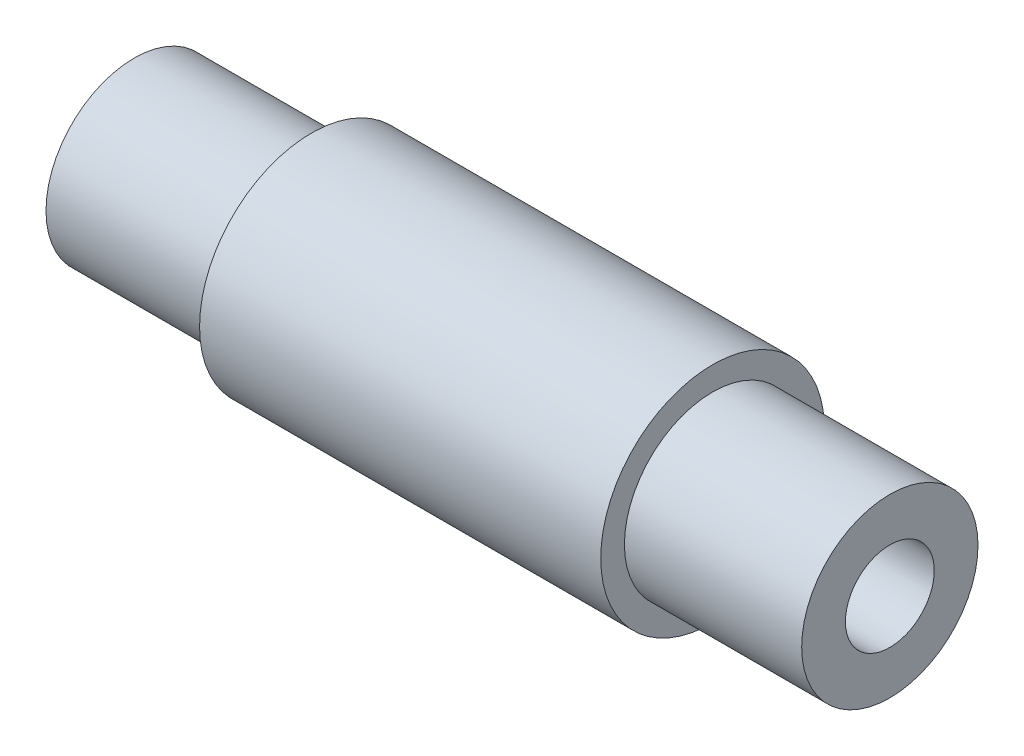
ISO-10303-21;
HEADER;
FILE_DESCRIPTION(('STEP AP214'),'2;1');
FILE_NAME('part.step','',(''),(''),'','','');
FILE_SCHEMA(('AUTOMOTIVE_DESIGN { 1 0 10303 214 1 1 1 1 }'));
ENDSEC;
DATA;
#1=APPLICATION_CONTEXT('core data for automotive mechanical design processes');
#2=APPLICATION_PROTOCOL_DEFINITION('international standard','automotive_design',2000,#1);
#3=PRODUCT_CONTEXT('',#1,'mechanical');
#4=PRODUCT('Part','Part','',(#3));
#5=PRODUCT_RELATED_PRODUCT_CATEGORY('part','',(#4));
#6=PRODUCT_DEFINITION_FORMATION('','',#4);
#7=PRODUCT_DEFINITION_CONTEXT('part definition',#1,'design');
#8=PRODUCT_DEFINITION('design','',#6,#7);
#9=PRODUCT_DEFINITION_SHAPE('','',#8);
#10=(LENGTH_UNIT() NAMED_UNIT(*) SI_UNIT(.MILLI.,.METRE.));
#11=(NAMED_UNIT(*) PLANE_ANGLE_UNIT() SI_UNIT($,.RADIAN.));
#12=(NAMED_UNIT(*) SI_UNIT($,.STERADIAN.) SOLID_ANGLE_UNIT());
#13=UNCERTAINTY_MEASURE_WITH_UNIT(LENGTH_MEASURE(1.E-05),#10,'distance_accuracy_value','');
#14=(GEOMETRIC_REPRESENTATION_CONTEXT(3) GLOBAL_UNCERTAINTY_ASSIGNED_CONTEXT((#13)) GLOBAL_UNIT_ASSIGNED_CONTEXT((#10,
#11,#12)) REPRESENTATION_CONTEXT('',''));
#15=CARTESIAN_POINT('',(0.,0.,0.));
#16=DIRECTION('',(0.,0.,1.));
#17=DIRECTION('',(1.,0.,0.));
#18=AXIS2_PLACEMENT_3D('',#15,#16,#17);
#19=CARTESIAN_POINT('',(-40.5,0.,0.));
#20=DIRECTION('',(1.,0.,0.));
#21=DIRECTION('',(0.,0.,-1.));
#22=AXIS2_PLACEMENT_3D('',#19,#20,#21);
#23=PLANE('',#22);
#24=CARTESIAN_POINT('',(-40.5,0.,0.));
#25=DIRECTION('',(1.,0.,0.));
#26=DIRECTION('',(0.,0.,-1.));
#27=AXIS2_PLACEMENT_3D('',#24,#25,#26);
#28=CIRCLE('',#27,4.7625);
#29=CARTESIAN_POINT('',(-40.5,0.,-4.7625));
#30=VERTEX_POINT('',#29);
#31=EDGE_CURVE('E53',#30,#30,#28,.F.);
#32=ORIENTED_EDGE('',*,*,#31,.F.);
#33=EDGE_LOOP('',(#32));
#34=FACE_BOUND('',#33,.T.);
#35=CARTESIAN_POINT('',(-40.5,0.,0.));
#36=DIRECTION('',(-1.,0.,0.));
#37=DIRECTION('',(0.,0.,1.));
#38=AXIS2_PLACEMENT_3D('',#35,#36,#37);
#39=CIRCLE('',#38,9.45);
#40=CARTESIAN_POINT('',(-40.5,0.,9.45));
#41=VERTEX_POINT('',#40);
#42=EDGE_CURVE('E10',#41,#41,#39,.T.);
#43=ORIENTED_EDGE('',*,*,#42,.T.);
#44=EDGE_LOOP('',(#43));
#45=FACE_BOUND('',#44,.T.);
#46=ADVANCED_FACE('F39',(#34,#45),#23,.F.);
#47=CARTESIAN_POINT('',(-1000.,0.,0.));
#48=DIRECTION('',(-1.,0.,0.));
#49=DIRECTION('',(0.,0.,1.));
#50=AXIS2_PLACEMENT_3D('',#47,#48,#49);
#51=CYLINDRICAL_SURFACE('',#50,9.45);
#52=ORIENTED_EDGE('',*,*,#42,.F.);
#53=EDGE_LOOP('',(#52));
#54=FACE_BOUND('',#53,.T.);
#55=CARTESIAN_POINT('',(-21.5,0.,0.));
#56=DIRECTION('',(-1.,0.,0.));
#57=DIRECTION('',(0.,0.,1.));
#58=AXIS2_PLACEMENT_3D('',#55,#56,#57);
#59=CIRCLE('',#58,9.45);
#60=CARTESIAN_POINT('',(-21.5,0.,9.45));
#61=VERTEX_POINT('',#60);
#62=EDGE_CURVE('E46',#61,#61,#59,.T.);
#63=ORIENTED_EDGE('',*,*,#62,.T.);
#64=EDGE_LOOP('',(#63));
#65=FACE_BOUND('',#64,.T.);
#66=ADVANCED_FACE('F114',(#54,#65),#51,.T.);
#67=CARTESIAN_POINT('',(-21.5,9.45,0.));
#68=DIRECTION('',(1.,0.,0.));
#69=DIRECTION('',(0.,0.,-1.));
#70=AXIS2_PLACEMENT_3D('',#67,#68,#69);
#71=PLANE('',#70);
#72=ORIENTED_EDGE('',*,*,#62,.F.);
#73=EDGE_LOOP('',(#72));
#74=FACE_BOUND('',#73,.T.);
#75=CARTESIAN_POINT('',(-21.5,0.,0.));
#76=DIRECTION('',(-1.,0.,0.));
#77=DIRECTION('',(0.,0.,1.));
#78=AXIS2_PLACEMENT_3D('',#75,#76,#77);
#79=CIRCLE('',#78,11.988);
#80=CARTESIAN_POINT('',(-21.5,0.,11.988));
#81=VERTEX_POINT('',#80);
#82=EDGE_CURVE('E51',#81,#81,#79,.T.);
#83=ORIENTED_EDGE('',*,*,#82,.T.);
#84=EDGE_LOOP('',(#83));
#85=FACE_BOUND('',#84,.T.);
#86=ADVANCED_FACE('F77',(#74,#85),#71,.F.);
#87=CARTESIAN_POINT('',(-1000.,0.,0.));
#88=DIRECTION('',(-1.,0.,0.));
#89=DIRECTION('',(0.,0.,1.));
#90=AXIS2_PLACEMENT_3D('',#87,#88,#89);
#91=CYLINDRICAL_SURFACE('',#90,11.988);
#92=ORIENTED_EDGE('',*,*,#82,.F.);
#93=EDGE_LOOP('',(#92));
#94=FACE_BOUND('',#93,.T.);
#95=CARTESIAN_POINT('',(21.5000000000001,0.,0.));
#96=DIRECTION('',(-1.,0.,0.));
#97=DIRECTION('',(0.,0.,1.));
#98=AXIS2_PLACEMENT_3D('',#95,#96,#97);
#99=CIRCLE('',#98,11.988);
#100=CARTESIAN_POINT('',(21.5000000000001,0.,11.988));
#101=VERTEX_POINT('',#100);
#102=EDGE_CURVE('E71',#101,#101,#99,.T.);
#103=ORIENTED_EDGE('',*,*,#102,.T.);
#104=EDGE_LOOP('',(#103));
#105=FACE_BOUND('',#104,.T.);
#106=ADVANCED_FACE('F76',(#94,#105),#91,.T.);
#107=CARTESIAN_POINT('',(21.5,11.988,0.));
#108=DIRECTION('',(-1.,0.,0.));
#109=DIRECTION('',(0.,0.,1.));
#110=AXIS2_PLACEMENT_3D('',#107,#108,#109);
#111=PLANE('',#110);
#112=ORIENTED_EDGE('',*,*,#102,.F.);
#113=EDGE_LOOP('',(#112));
#114=FACE_BOUND('',#113,.T.);
#115=CARTESIAN_POINT('',(21.5000000000001,0.,0.));
#116=DIRECTION('',(-1.,0.,0.));
#117=DIRECTION('',(0.,0.,1.));
#118=AXIS2_PLACEMENT_3D('',#115,#116,#117);
#119=CIRCLE('',#118,9.45);
#120=CARTESIAN_POINT('',(21.5000000000001,0.,9.45));
#121=VERTEX_POINT('',#120);
#122=EDGE_CURVE('E63',#121,#121,#119,.T.);
#123=ORIENTED_EDGE('',*,*,#122,.T.);
#124=EDGE_LOOP('',(#123));
#125=FACE_BOUND('',#124,.T.);
#126=ADVANCED_FACE('F83',(#114,#125),#111,.F.);
#127=CARTESIAN_POINT('',(-1000.,0.,0.));
#128=DIRECTION('',(-1.,0.,0.));
#129=DIRECTION('',(0.,0.,1.));
#130=AXIS2_PLACEMENT_3D('',#127,#128,#129);
#131=CYLINDRICAL_SURFACE('',#130,9.45);
#132=ORIENTED_EDGE('',*,*,#122,.F.);
#133=EDGE_LOOP('',(#132));
#134=FACE_BOUND('',#133,.T.);
#135=CARTESIAN_POINT('',(40.5,0.,0.));
#136=DIRECTION('',(-1.,0.,0.));
#137=DIRECTION('',(0.,0.,1.));
#138=AXIS2_PLACEMENT_3D('',#135,#136,#137);
#139=CIRCLE('',#138,9.45);
#140=CARTESIAN_POINT('',(40.5,0.,9.45));
#141=VERTEX_POINT('',#140);
#142=EDGE_CURVE('E57',#141,#141,#139,.T.);
#143=ORIENTED_EDGE('',*,*,#142,.T.);
#144=EDGE_LOOP('',(#143));
#145=FACE_BOUND('',#144,.T.);
#146=ADVANCED_FACE('F90',(#134,#145),#131,.T.);
#147=CARTESIAN_POINT('',(40.5,9.45,0.));
#148=DIRECTION('',(-1.,0.,0.));
#149=DIRECTION('',(0.,0.,1.));
#150=AXIS2_PLACEMENT_3D('',#147,#148,#149);
#151=PLANE('',#150);
#152=CARTESIAN_POINT('',(40.5,0.,0.));
#153=DIRECTION('',(-1.,0.,0.));
#154=DIRECTION('',(0.,0.,1.));
#155=AXIS2_PLACEMENT_3D('',#152,#153,#154);
#156=CIRCLE('',#155,4.7625);
#157=CARTESIAN_POINT('',(40.5,0.,4.7625));
#158=VERTEX_POINT('',#157);
#159=EDGE_CURVE('E45',#158,#158,#156,.F.);
#160=ORIENTED_EDGE('',*,*,#159,.F.);
#161=EDGE_LOOP('',(#160));
#162=FACE_BOUND('',#161,.T.);
#163=ORIENTED_EDGE('',*,*,#142,.F.);
#164=EDGE_LOOP('',(#163));
#165=FACE_BOUND('',#164,.T.);
#166=ADVANCED_FACE('F92',(#162,#165),#151,.F.);
#167=CARTESIAN_POINT('',(-1000.,0.,0.));
#168=DIRECTION('',(-1.,0.,0.));
#169=DIRECTION('',(0.,0.,1.));
#170=AXIS2_PLACEMENT_3D('',#167,#168,#169);
#171=CYLINDRICAL_SURFACE('',#170,4.7625);
#172=CARTESIAN_POINT('',(-23.7000000000001,0.,0.));
#173=DIRECTION('',(-1.,0.,0.));
#174=DIRECTION('',(0.,0.,1.));
#175=AXIS2_PLACEMENT_3D('',#172,#173,#174);
#176=CIRCLE('',#175,4.7625);
#177=CARTESIAN_POINT('',(-23.7000000000001,0.,4.7625));
#178=VERTEX_POINT('',#177);
#179=EDGE_CURVE('E60',#178,#178,#176,.T.);
#180=ORIENTED_EDGE('',*,*,#179,.F.);
#181=EDGE_LOOP('',(#180));
#182=FACE_BOUND('',#181,.T.);
#183=ORIENTED_EDGE('',*,*,#31,.T.);
#184=EDGE_LOOP('',(#183));
#185=FACE_BOUND('',#184,.T.);
#186=ADVANCED_FACE('F99',(#182,#185),#171,.F.);
#187=CARTESIAN_POINT('',(-23.7,4.7625,0.));
#188=DIRECTION('',(-1.,0.,0.));
#189=DIRECTION('',(0.,0.,1.));
#190=AXIS2_PLACEMENT_3D('',#187,#188,#189);
#191=PLANE('',#190);
#192=ORIENTED_EDGE('',*,*,#179,.T.);
#193=EDGE_LOOP('',(#192));
#194=FACE_BOUND('',#193,.T.);
#195=ADVANCED_FACE('F107',(#194),#191,.T.);
#196=CARTESIAN_POINT('',(-1000.,0.,0.));
#197=DIRECTION('',(-1.,0.,0.));
#198=DIRECTION('',(0.,0.,1.));
#199=AXIS2_PLACEMENT_3D('',#196,#197,#198);
#200=CYLINDRICAL_SURFACE('',#199,4.7625);
#201=CARTESIAN_POINT('',(23.7000000000001,0.,0.));
#202=DIRECTION('',(-1.,0.,0.));
#203=DIRECTION('',(0.,0.,1.));
#204=AXIS2_PLACEMENT_3D('',#201,#202,#203);
#205=CIRCLE('',#204,4.7625);
#206=CARTESIAN_POINT('',(23.7000000000001,0.,4.7625));
#207=VERTEX_POINT('',#206);
#208=EDGE_CURVE('E68',#207,#207,#205,.T.);
#209=ORIENTED_EDGE('',*,*,#208,.T.);
#210=EDGE_LOOP('',(#209));
#211=FACE_BOUND('',#210,.T.);
#212=ORIENTED_EDGE('',*,*,#159,.T.);
#213=EDGE_LOOP('',(#212));
#214=FACE_BOUND('',#213,.T.);
#215=ADVANCED_FACE('F165',(#211,#214),#200,.F.);
#216=CARTESIAN_POINT('',(23.7,0.,0.));
#217=DIRECTION('',(1.,0.,0.));
#218=DIRECTION('',(0.,0.,-1.));
#219=AXIS2_PLACEMENT_3D('',#216,#217,#218);
#220=PLANE('',#219);
#221=ORIENTED_EDGE('',*,*,#208,.F.);
#222=EDGE_LOOP('',(#221));
#223=FACE_BOUND('',#222,.T.);
#224=ADVANCED_FACE('F168',(#223),#220,.T.);
#225=CLOSED_SHELL('',(#46,#66,#86,#106,#126,#146,#166,#186,#195,#215,#224));
#226=MANIFOLD_SOLID_BREP('B2',#225);
#227=ADVANCED_BREP_SHAPE_REPRESENTATION('',(#18,#226),#14);
#228=SHAPE_DEFINITION_REPRESENTATION(#9,#227);
ENDSEC;
END-ISO-10303-21;
